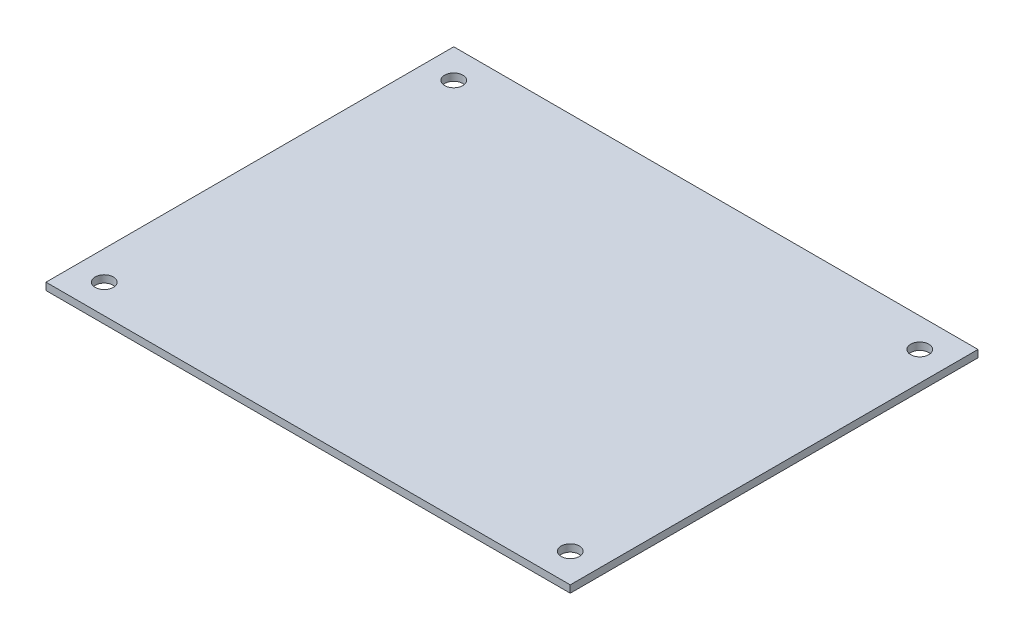
ISO-10303-21;
HEADER;
FILE_DESCRIPTION(('STEP AP214'),'2;1');
FILE_NAME('part.step','',(''),(''),'','','');
FILE_SCHEMA(('AUTOMOTIVE_DESIGN { 1 0 10303 214 1 1 1 1 }'));
ENDSEC;
DATA;
#1=APPLICATION_CONTEXT('core data for automotive mechanical design processes');
#2=APPLICATION_PROTOCOL_DEFINITION('international standard','automotive_design',2000,#1);
#3=PRODUCT_CONTEXT('',#1,'mechanical');
#4=PRODUCT('Part','Part','',(#3));
#5=PRODUCT_RELATED_PRODUCT_CATEGORY('part','',(#4));
#6=PRODUCT_DEFINITION_FORMATION('','',#4);
#7=PRODUCT_DEFINITION_CONTEXT('part definition',#1,'design');
#8=PRODUCT_DEFINITION('design','',#6,#7);
#9=PRODUCT_DEFINITION_SHAPE('','',#8);
#10=(LENGTH_UNIT() NAMED_UNIT(*) SI_UNIT(.MILLI.,.METRE.));
#11=(NAMED_UNIT(*) PLANE_ANGLE_UNIT() SI_UNIT($,.RADIAN.));
#12=(NAMED_UNIT(*) SI_UNIT($,.STERADIAN.) SOLID_ANGLE_UNIT());
#13=UNCERTAINTY_MEASURE_WITH_UNIT(LENGTH_MEASURE(1.E-05),#10,'distance_accuracy_value','');
#14=(GEOMETRIC_REPRESENTATION_CONTEXT(3) GLOBAL_UNCERTAINTY_ASSIGNED_CONTEXT((#13)) GLOBAL_UNIT_ASSIGNED_CONTEXT((#10,
#11,#12)) REPRESENTATION_CONTEXT('',''));
#15=CARTESIAN_POINT('',(0.,0.,0.));
#16=DIRECTION('',(0.,0.,1.));
#17=DIRECTION('',(1.,0.,0.));
#18=AXIS2_PLACEMENT_3D('',#15,#16,#17);
#19=CARTESIAN_POINT('',(0.,1.27,0.));
#20=DIRECTION('',(0.,-1.,0.));
#21=DIRECTION('',(0.,0.,-1.));
#22=AXIS2_PLACEMENT_3D('',#19,#20,#21);
#23=PLANE('',#22);
#24=DIRECTION('',(0.,0.,-1.));
#25=VECTOR('',#24,1.);
#26=CARTESIAN_POINT('',(45.72,1.27,35.56));
#27=LINE('',#26,#25);
#28=CARTESIAN_POINT('',(45.72,1.27,35.56));
#29=VERTEX_POINT('',#28);
#30=CARTESIAN_POINT('',(45.72,1.27,-35.56));
#31=VERTEX_POINT('',#30);
#32=EDGE_CURVE('E89',#29,#31,#27,.T.);
#33=ORIENTED_EDGE('',*,*,#32,.T.);
#34=DIRECTION('',(-1.,0.,0.));
#35=VECTOR('',#34,1.);
#36=CARTESIAN_POINT('',(-45.72,1.27,-35.56));
#37=LINE('',#36,#35);
#38=CARTESIAN_POINT('',(-45.72,1.27,-35.56));
#39=VERTEX_POINT('',#38);
#40=EDGE_CURVE('E84',#31,#39,#37,.T.);
#41=ORIENTED_EDGE('',*,*,#40,.T.);
#42=DIRECTION('',(0.,0.,1.));
#43=VECTOR('',#42,1.);
#44=CARTESIAN_POINT('',(-45.72,1.27,35.56));
#45=LINE('',#44,#43);
#46=CARTESIAN_POINT('',(-45.72,1.27,35.56));
#47=VERTEX_POINT('',#46);
#48=EDGE_CURVE('E87',#39,#47,#45,.T.);
#49=ORIENTED_EDGE('',*,*,#48,.T.);
#50=DIRECTION('',(1.,0.,0.));
#51=VECTOR('',#50,1.);
#52=CARTESIAN_POINT('',(-45.72,1.27,35.56));
#53=LINE('',#52,#51);
#54=EDGE_CURVE('E54',#47,#29,#53,.T.);
#55=ORIENTED_EDGE('',*,*,#54,.T.);
#56=EDGE_LOOP('',(#33,#41,#49,#55));
#57=FACE_BOUND('',#56,.T.);
#58=CARTESIAN_POINT('',(-40.64,1.27,-30.48));
#59=DIRECTION('',(0.,1.,0.));
#60=DIRECTION('',(0.,0.,1.));
#61=AXIS2_PLACEMENT_3D('',#58,#59,#60);
#62=CIRCLE('',#61,1.5875);
#63=CARTESIAN_POINT('',(-40.64,1.27,-28.8925));
#64=VERTEX_POINT('',#63);
#65=EDGE_CURVE('E104',#64,#64,#62,.T.);
#66=ORIENTED_EDGE('',*,*,#65,.F.);
#67=EDGE_LOOP('',(#66));
#68=FACE_BOUND('',#67,.T.);
#69=CARTESIAN_POINT('',(40.64,1.27,-30.48));
#70=DIRECTION('',(0.,1.,0.));
#71=DIRECTION('',(0.,0.,1.));
#72=AXIS2_PLACEMENT_3D('',#69,#70,#71);
#73=CIRCLE('',#72,1.5875);
#74=CARTESIAN_POINT('',(40.64,1.27,-28.8925));
#75=VERTEX_POINT('',#74);
#76=EDGE_CURVE('E119',#75,#75,#73,.T.);
#77=ORIENTED_EDGE('',*,*,#76,.F.);
#78=EDGE_LOOP('',(#77));
#79=FACE_BOUND('',#78,.T.);
#80=CARTESIAN_POINT('',(40.64,1.27,30.48));
#81=DIRECTION('',(0.,1.,0.));
#82=DIRECTION('',(0.,0.,1.));
#83=AXIS2_PLACEMENT_3D('',#80,#81,#82);
#84=CIRCLE('',#83,1.5875);
#85=CARTESIAN_POINT('',(40.64,1.27,32.0675));
#86=VERTEX_POINT('',#85);
#87=EDGE_CURVE('E125',#86,#86,#84,.T.);
#88=ORIENTED_EDGE('',*,*,#87,.F.);
#89=EDGE_LOOP('',(#88));
#90=FACE_BOUND('',#89,.T.);
#91=CARTESIAN_POINT('',(-40.64,1.27,30.48));
#92=DIRECTION('',(0.,1.,0.));
#93=DIRECTION('',(0.,0.,1.));
#94=AXIS2_PLACEMENT_3D('',#91,#92,#93);
#95=CIRCLE('',#94,1.5875);
#96=CARTESIAN_POINT('',(-40.64,1.27,32.0675));
#97=VERTEX_POINT('',#96);
#98=EDGE_CURVE('E131',#97,#97,#95,.T.);
#99=ORIENTED_EDGE('',*,*,#98,.F.);
#100=EDGE_LOOP('',(#99));
#101=FACE_BOUND('',#100,.T.);
#102=ADVANCED_FACE('F37',(#57,#68,#79,#90,#101),#23,.F.);
#103=CARTESIAN_POINT('',(0.,0.,0.));
#104=DIRECTION('',(0.,-1.,0.));
#105=DIRECTION('',(0.,0.,-1.));
#106=AXIS2_PLACEMENT_3D('',#103,#104,#105);
#107=PLANE('',#106);
#108=CARTESIAN_POINT('',(40.64,0.,30.48));
#109=DIRECTION('',(0.,1.,0.));
#110=DIRECTION('',(0.,0.,1.));
#111=AXIS2_PLACEMENT_3D('',#108,#109,#110);
#112=CIRCLE('',#111,1.5875);
#113=CARTESIAN_POINT('',(40.64,0.,32.0675));
#114=VERTEX_POINT('',#113);
#115=EDGE_CURVE('E128',#114,#114,#112,.T.);
#116=ORIENTED_EDGE('',*,*,#115,.T.);
#117=EDGE_LOOP('',(#116));
#118=FACE_BOUND('',#117,.T.);
#119=CARTESIAN_POINT('',(-40.64,0.,-30.48));
#120=DIRECTION('',(0.,1.,0.));
#121=DIRECTION('',(0.,0.,1.));
#122=AXIS2_PLACEMENT_3D('',#119,#120,#121);
#123=CIRCLE('',#122,1.5875);
#124=CARTESIAN_POINT('',(-40.64,0.,-28.8925));
#125=VERTEX_POINT('',#124);
#126=EDGE_CURVE('E116',#125,#125,#123,.T.);
#127=ORIENTED_EDGE('',*,*,#126,.T.);
#128=EDGE_LOOP('',(#127));
#129=FACE_BOUND('',#128,.T.);
#130=DIRECTION('',(0.,0.,-1.));
#131=VECTOR('',#130,1.);
#132=CARTESIAN_POINT('',(45.72,0.,35.56));
#133=LINE('',#132,#131);
#134=CARTESIAN_POINT('',(45.72,0.,35.56));
#135=VERTEX_POINT('',#134);
#136=CARTESIAN_POINT('',(45.72,0.,-35.56));
#137=VERTEX_POINT('',#136);
#138=EDGE_CURVE('E101',#135,#137,#133,.T.);
#139=ORIENTED_EDGE('',*,*,#138,.F.);
#140=DIRECTION('',(1.,0.,0.));
#141=VECTOR('',#140,1.);
#142=CARTESIAN_POINT('',(-45.72,0.,35.56));
#143=LINE('',#142,#141);
#144=CARTESIAN_POINT('',(-45.72,0.,35.56));
#145=VERTEX_POINT('',#144);
#146=EDGE_CURVE('E77',#145,#135,#143,.T.);
#147=ORIENTED_EDGE('',*,*,#146,.F.);
#148=DIRECTION('',(0.,0.,1.));
#149=VECTOR('',#148,1.);
#150=CARTESIAN_POINT('',(-45.72,0.,35.56));
#151=LINE('',#150,#149);
#152=CARTESIAN_POINT('',(-45.72,0.,-35.56));
#153=VERTEX_POINT('',#152);
#154=EDGE_CURVE('E71',#153,#145,#151,.T.);
#155=ORIENTED_EDGE('',*,*,#154,.F.);
#156=DIRECTION('',(-1.,0.,0.));
#157=VECTOR('',#156,1.);
#158=CARTESIAN_POINT('',(-45.72,0.,-35.56));
#159=LINE('',#158,#157);
#160=EDGE_CURVE('E93',#137,#153,#159,.T.);
#161=ORIENTED_EDGE('',*,*,#160,.F.);
#162=EDGE_LOOP('',(#139,#147,#155,#161));
#163=FACE_BOUND('',#162,.T.);
#164=CARTESIAN_POINT('',(40.64,0.,-30.48));
#165=DIRECTION('',(0.,1.,0.));
#166=DIRECTION('',(0.,0.,1.));
#167=AXIS2_PLACEMENT_3D('',#164,#165,#166);
#168=CIRCLE('',#167,1.5875);
#169=CARTESIAN_POINT('',(40.64,0.,-28.8925));
#170=VERTEX_POINT('',#169);
#171=EDGE_CURVE('E122',#170,#170,#168,.T.);
#172=ORIENTED_EDGE('',*,*,#171,.T.);
#173=EDGE_LOOP('',(#172));
#174=FACE_BOUND('',#173,.T.);
#175=CARTESIAN_POINT('',(-40.64,0.,30.48));
#176=DIRECTION('',(0.,1.,0.));
#177=DIRECTION('',(0.,0.,1.));
#178=AXIS2_PLACEMENT_3D('',#175,#176,#177);
#179=CIRCLE('',#178,1.5875);
#180=CARTESIAN_POINT('',(-40.64,0.,32.0675));
#181=VERTEX_POINT('',#180);
#182=EDGE_CURVE('E134',#181,#181,#179,.T.);
#183=ORIENTED_EDGE('',*,*,#182,.T.);
#184=EDGE_LOOP('',(#183));
#185=FACE_BOUND('',#184,.T.);
#186=ADVANCED_FACE('F112',(#118,#129,#163,#174,#185),#107,.T.);
#187=CARTESIAN_POINT('',(45.72,1.27,35.56));
#188=DIRECTION('',(-1.,0.,0.));
#189=DIRECTION('',(0.,0.,1.));
#190=AXIS2_PLACEMENT_3D('',#187,#188,#189);
#191=PLANE('',#190);
#192=ORIENTED_EDGE('',*,*,#138,.T.);
#193=DIRECTION('',(0.,-1.,0.));
#194=VECTOR('',#193,1.);
#195=CARTESIAN_POINT('',(45.72,1.27,-35.56));
#196=LINE('',#195,#194);
#197=EDGE_CURVE('E11',#31,#137,#196,.T.);
#198=ORIENTED_EDGE('',*,*,#197,.F.);
#199=ORIENTED_EDGE('',*,*,#32,.F.);
#200=DIRECTION('',(0.,-1.,0.));
#201=VECTOR('',#200,1.);
#202=CARTESIAN_POINT('',(45.72,1.27,35.56));
#203=LINE('',#202,#201);
#204=EDGE_CURVE('E97',#29,#135,#203,.T.);
#205=ORIENTED_EDGE('',*,*,#204,.T.);
#206=EDGE_LOOP('',(#192,#198,#199,#205));
#207=FACE_BOUND('',#206,.T.);
#208=ADVANCED_FACE('F39',(#207),#191,.F.);
#209=CARTESIAN_POINT('',(-45.72,1.27,-35.56));
#210=DIRECTION('',(0.,0.,1.));
#211=DIRECTION('',(1.,0.,0.));
#212=AXIS2_PLACEMENT_3D('',#209,#210,#211);
#213=PLANE('',#212);
#214=ORIENTED_EDGE('',*,*,#160,.T.);
#215=DIRECTION('',(0.,-1.,0.));
#216=VECTOR('',#215,1.);
#217=CARTESIAN_POINT('',(-45.72,1.27,-35.56));
#218=LINE('',#217,#216);
#219=EDGE_CURVE('E46',#39,#153,#218,.T.);
#220=ORIENTED_EDGE('',*,*,#219,.F.);
#221=ORIENTED_EDGE('',*,*,#40,.F.);
#222=ORIENTED_EDGE('',*,*,#197,.T.);
#223=EDGE_LOOP('',(#214,#220,#221,#222));
#224=FACE_BOUND('',#223,.T.);
#225=ADVANCED_FACE('F92',(#224),#213,.F.);
#226=CARTESIAN_POINT('',(-45.72,1.27,35.56));
#227=DIRECTION('',(1.,0.,0.));
#228=DIRECTION('',(0.,0.,-1.));
#229=AXIS2_PLACEMENT_3D('',#226,#227,#228);
#230=PLANE('',#229);
#231=ORIENTED_EDGE('',*,*,#154,.T.);
#232=DIRECTION('',(0.,-1.,0.));
#233=VECTOR('',#232,1.);
#234=CARTESIAN_POINT('',(-45.72,1.27,35.56));
#235=LINE('',#234,#233);
#236=EDGE_CURVE('E94',#47,#145,#235,.T.);
#237=ORIENTED_EDGE('',*,*,#236,.F.);
#238=ORIENTED_EDGE('',*,*,#48,.F.);
#239=ORIENTED_EDGE('',*,*,#219,.T.);
#240=EDGE_LOOP('',(#231,#237,#238,#239));
#241=FACE_BOUND('',#240,.T.);
#242=ADVANCED_FACE('F95',(#241),#230,.F.);
#243=CARTESIAN_POINT('',(-45.72,1.27,35.56));
#244=DIRECTION('',(0.,0.,-1.));
#245=DIRECTION('',(-1.,0.,0.));
#246=AXIS2_PLACEMENT_3D('',#243,#244,#245);
#247=PLANE('',#246);
#248=ORIENTED_EDGE('',*,*,#146,.T.);
#249=ORIENTED_EDGE('',*,*,#204,.F.);
#250=ORIENTED_EDGE('',*,*,#54,.F.);
#251=ORIENTED_EDGE('',*,*,#236,.T.);
#252=EDGE_LOOP('',(#248,#249,#250,#251));
#253=FACE_BOUND('',#252,.T.);
#254=ADVANCED_FACE('F109',(#253),#247,.F.);
#255=CARTESIAN_POINT('',(-40.64,1.27,-30.48));
#256=DIRECTION('',(0.,-1.,0.));
#257=DIRECTION('',(0.,0.,-1.));
#258=AXIS2_PLACEMENT_3D('',#255,#256,#257);
#259=CYLINDRICAL_SURFACE('',#258,1.5875);
#260=ORIENTED_EDGE('',*,*,#65,.T.);
#261=EDGE_LOOP('',(#260));
#262=FACE_BOUND('',#261,.T.);
#263=ORIENTED_EDGE('',*,*,#126,.F.);
#264=EDGE_LOOP('',(#263));
#265=FACE_BOUND('',#264,.T.);
#266=ADVANCED_FACE('F151',(#262,#265),#259,.F.);
#267=CARTESIAN_POINT('',(40.64,1.27,-30.48));
#268=DIRECTION('',(0.,-1.,0.));
#269=DIRECTION('',(0.,0.,-1.));
#270=AXIS2_PLACEMENT_3D('',#267,#268,#269);
#271=CYLINDRICAL_SURFACE('',#270,1.5875);
#272=ORIENTED_EDGE('',*,*,#76,.T.);
#273=EDGE_LOOP('',(#272));
#274=FACE_BOUND('',#273,.T.);
#275=ORIENTED_EDGE('',*,*,#171,.F.);
#276=EDGE_LOOP('',(#275));
#277=FACE_BOUND('',#276,.T.);
#278=ADVANCED_FACE('F205',(#274,#277),#271,.F.);
#279=CARTESIAN_POINT('',(40.64,1.27,30.48));
#280=DIRECTION('',(0.,-1.,0.));
#281=DIRECTION('',(0.,0.,-1.));
#282=AXIS2_PLACEMENT_3D('',#279,#280,#281);
#283=CYLINDRICAL_SURFACE('',#282,1.5875);
#284=ORIENTED_EDGE('',*,*,#87,.T.);
#285=EDGE_LOOP('',(#284));
#286=FACE_BOUND('',#285,.T.);
#287=ORIENTED_EDGE('',*,*,#115,.F.);
#288=EDGE_LOOP('',(#287));
#289=FACE_BOUND('',#288,.T.);
#290=ADVANCED_FACE('F214',(#286,#289),#283,.F.);
#291=CARTESIAN_POINT('',(-40.64,1.27,30.48));
#292=DIRECTION('',(0.,-1.,0.));
#293=DIRECTION('',(0.,0.,-1.));
#294=AXIS2_PLACEMENT_3D('',#291,#292,#293);
#295=CYLINDRICAL_SURFACE('',#294,1.5875);
#296=ORIENTED_EDGE('',*,*,#98,.T.);
#297=EDGE_LOOP('',(#296));
#298=FACE_BOUND('',#297,.T.);
#299=ORIENTED_EDGE('',*,*,#182,.F.);
#300=EDGE_LOOP('',(#299));
#301=FACE_BOUND('',#300,.T.);
#302=ADVANCED_FACE('F140',(#298,#301),#295,.F.);
#303=CLOSED_SHELL('',(#102,#186,#208,#225,#242,#254,#266,#278,#290,#302));
#304=MANIFOLD_SOLID_BREP('B2',#303);
#305=ADVANCED_BREP_SHAPE_REPRESENTATION('',(#18,#304),#14);
#306=SHAPE_DEFINITION_REPRESENTATION(#9,#305);
ENDSEC;
END-ISO-10303-21;
